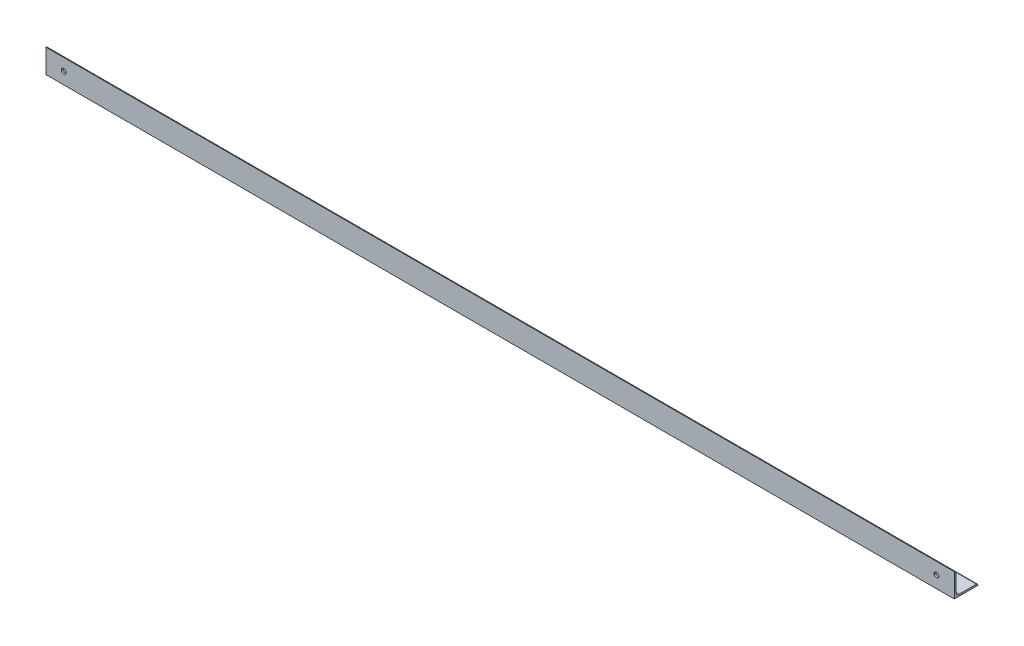
ISO-10303-21;
HEADER;
FILE_DESCRIPTION(('STEP AP214'),'2;1');
FILE_NAME('part.step','',(''),(''),'','','');
FILE_SCHEMA(('AUTOMOTIVE_DESIGN { 1 0 10303 214 1 1 1 1 }'));
ENDSEC;
DATA;
#1=APPLICATION_CONTEXT('core data for automotive mechanical design processes');
#2=APPLICATION_PROTOCOL_DEFINITION('international standard','automotive_design',2000,#1);
#3=PRODUCT_CONTEXT('',#1,'mechanical');
#4=PRODUCT('Part','Part','',(#3));
#5=PRODUCT_RELATED_PRODUCT_CATEGORY('part','',(#4));
#6=PRODUCT_DEFINITION_FORMATION('','',#4);
#7=PRODUCT_DEFINITION_CONTEXT('part definition',#1,'design');
#8=PRODUCT_DEFINITION('design','',#6,#7);
#9=PRODUCT_DEFINITION_SHAPE('','',#8);
#10=(LENGTH_UNIT() NAMED_UNIT(*) SI_UNIT(.MILLI.,.METRE.));
#11=(NAMED_UNIT(*) PLANE_ANGLE_UNIT() SI_UNIT($,.RADIAN.));
#12=(NAMED_UNIT(*) SI_UNIT($,.STERADIAN.) SOLID_ANGLE_UNIT());
#13=UNCERTAINTY_MEASURE_WITH_UNIT(LENGTH_MEASURE(1.E-05),#10,'distance_accuracy_value','');
#14=(GEOMETRIC_REPRESENTATION_CONTEXT(3) GLOBAL_UNCERTAINTY_ASSIGNED_CONTEXT((#13)) GLOBAL_UNIT_ASSIGNED_CONTEXT((#10,
#11,#12)) REPRESENTATION_CONTEXT('',''));
#15=CARTESIAN_POINT('',(0.,0.,0.));
#16=DIRECTION('',(0.,0.,1.));
#17=DIRECTION('',(1.,0.,0.));
#18=AXIS2_PLACEMENT_3D('',#15,#16,#17);
#19=CARTESIAN_POINT('',(1530.,0.,-40.));
#20=DIRECTION('',(0.,1.,0.));
#21=DIRECTION('',(0.,0.,1.));
#22=AXIS2_PLACEMENT_3D('',#19,#20,#21);
#23=PLANE('',#22);
#24=DIRECTION('',(0.,0.,-1.));
#25=VECTOR('',#24,1.);
#26=CARTESIAN_POINT('',(0.,0.,-40.));
#27=LINE('',#26,#25);
#28=CARTESIAN_POINT('',(0.,0.,0.));
#29=VERTEX_POINT('',#28);
#30=CARTESIAN_POINT('',(0.,0.,-40.));
#31=VERTEX_POINT('',#30);
#32=EDGE_CURVE('E153',#29,#31,#27,.T.);
#33=ORIENTED_EDGE('',*,*,#32,.T.);
#34=DIRECTION('',(-1.,0.,0.));
#35=VECTOR('',#34,1.);
#36=CARTESIAN_POINT('',(1530.,0.,-40.));
#37=LINE('',#36,#35);
#38=CARTESIAN_POINT('',(1530.,0.,-40.));
#39=VERTEX_POINT('',#38);
#40=EDGE_CURVE('E13',#39,#31,#37,.T.);
#41=ORIENTED_EDGE('',*,*,#40,.F.);
#42=DIRECTION('',(0.,0.,-1.));
#43=VECTOR('',#42,1.);
#44=CARTESIAN_POINT('',(1530.,0.,-40.));
#45=LINE('',#44,#43);
#46=CARTESIAN_POINT('',(1530.,0.,0.));
#47=VERTEX_POINT('',#46);
#48=EDGE_CURVE('E166',#47,#39,#45,.T.);
#49=ORIENTED_EDGE('',*,*,#48,.F.);
#50=DIRECTION('',(-1.,0.,0.));
#51=VECTOR('',#50,1.);
#52=CARTESIAN_POINT('',(1530.,0.,0.));
#53=LINE('',#52,#51);
#54=EDGE_CURVE('E149',#47,#29,#53,.T.);
#55=ORIENTED_EDGE('',*,*,#54,.T.);
#56=EDGE_LOOP('',(#33,#41,#49,#55));
#57=FACE_BOUND('',#56,.T.);
#58=ADVANCED_FACE('F63',(#57),#23,.F.);
#59=CARTESIAN_POINT('',(1530.,0.,-37.));
#60=DIRECTION('',(-1.,0.,0.));
#61=DIRECTION('',(0.,0.,1.));
#62=AXIS2_PLACEMENT_3D('',#59,#60,#61);
#63=CYLINDRICAL_SURFACE('',#62,3.);
#64=CARTESIAN_POINT('',(0.,0.,-37.));
#65=DIRECTION('',(1.,0.,0.));
#66=DIRECTION('',(0.,0.,-1.));
#67=AXIS2_PLACEMENT_3D('',#64,#65,#66);
#68=CIRCLE('',#67,3.);
#69=CARTESIAN_POINT('',(0.,3.,-37.));
#70=VERTEX_POINT('',#69);
#71=EDGE_CURVE('E156',#31,#70,#68,.T.);
#72=ORIENTED_EDGE('',*,*,#71,.T.);
#73=DIRECTION('',(-1.,0.,0.));
#74=VECTOR('',#73,1.);
#75=CARTESIAN_POINT('',(1530.,3.,-37.));
#76=LINE('',#75,#74);
#77=CARTESIAN_POINT('',(1530.,3.,-37.));
#78=VERTEX_POINT('',#77);
#79=EDGE_CURVE('E71',#78,#70,#76,.T.);
#80=ORIENTED_EDGE('',*,*,#79,.F.);
#81=CARTESIAN_POINT('',(1530.,0.,-37.));
#82=DIRECTION('',(1.,0.,0.));
#83=DIRECTION('',(0.,0.,-1.));
#84=AXIS2_PLACEMENT_3D('',#81,#82,#83);
#85=CIRCLE('',#84,3.);
#86=EDGE_CURVE('E119',#39,#78,#85,.T.);
#87=ORIENTED_EDGE('',*,*,#86,.F.);
#88=ORIENTED_EDGE('',*,*,#40,.T.);
#89=EDGE_LOOP('',(#72,#80,#87,#88));
#90=FACE_BOUND('',#89,.T.);
#91=ADVANCED_FACE('F226',(#90),#63,.T.);
#92=CARTESIAN_POINT('',(1530.,3.,-9.));
#93=DIRECTION('',(0.,-1.,0.));
#94=DIRECTION('',(0.,0.,-1.));
#95=AXIS2_PLACEMENT_3D('',#92,#93,#94);
#96=PLANE('',#95);
#97=DIRECTION('',(0.,0.,1.));
#98=VECTOR('',#97,1.);
#99=CARTESIAN_POINT('',(0.,3.,-9.));
#100=LINE('',#99,#98);
#101=CARTESIAN_POINT('',(0.,3.,-9.00000000000001));
#102=VERTEX_POINT('',#101);
#103=EDGE_CURVE('E159',#70,#102,#100,.T.);
#104=ORIENTED_EDGE('',*,*,#103,.T.);
#105=DIRECTION('',(-1.,0.,0.));
#106=VECTOR('',#105,1.);
#107=CARTESIAN_POINT('',(1530.,3.,-9.00000000000001));
#108=LINE('',#107,#106);
#109=CARTESIAN_POINT('',(1530.,3.,-9.00000000000001));
#110=VERTEX_POINT('',#109);
#111=EDGE_CURVE('E170',#110,#102,#108,.T.);
#112=ORIENTED_EDGE('',*,*,#111,.F.);
#113=DIRECTION('',(0.,0.,1.));
#114=VECTOR('',#113,1.);
#115=CARTESIAN_POINT('',(1530.,3.,-9.));
#116=LINE('',#115,#114);
#117=EDGE_CURVE('E178',#78,#110,#116,.T.);
#118=ORIENTED_EDGE('',*,*,#117,.F.);
#119=ORIENTED_EDGE('',*,*,#79,.T.);
#120=EDGE_LOOP('',(#104,#112,#118,#119));
#121=FACE_BOUND('',#120,.T.);
#122=ADVANCED_FACE('F176',(#121),#96,.F.);
#123=CARTESIAN_POINT('',(1530.,9.,-9.));
#124=DIRECTION('',(-1.,0.,0.));
#125=DIRECTION('',(0.,0.,1.));
#126=AXIS2_PLACEMENT_3D('',#123,#124,#125);
#127=CYLINDRICAL_SURFACE('',#126,6.);
#128=CARTESIAN_POINT('',(0.,9.,-9.));
#129=DIRECTION('',(-1.,0.,0.));
#130=DIRECTION('',(0.,0.,1.));
#131=AXIS2_PLACEMENT_3D('',#128,#129,#130);
#132=CIRCLE('',#131,6.);
#133=CARTESIAN_POINT('',(0.,9.,-3.));
#134=VERTEX_POINT('',#133);
#135=EDGE_CURVE('E161',#102,#134,#132,.T.);
#136=ORIENTED_EDGE('',*,*,#135,.T.);
#137=DIRECTION('',(-1.,0.,0.));
#138=VECTOR('',#137,1.);
#139=CARTESIAN_POINT('',(1530.,9.,-3.));
#140=LINE('',#139,#138);
#141=CARTESIAN_POINT('',(1530.,9.,-3.));
#142=VERTEX_POINT('',#141);
#143=EDGE_CURVE('E144',#142,#134,#140,.T.);
#144=ORIENTED_EDGE('',*,*,#143,.F.);
#145=CARTESIAN_POINT('',(1530.,9.,-9.));
#146=DIRECTION('',(-1.,0.,0.));
#147=DIRECTION('',(0.,0.,1.));
#148=AXIS2_PLACEMENT_3D('',#145,#146,#147);
#149=CIRCLE('',#148,6.);
#150=EDGE_CURVE('E135',#110,#142,#149,.T.);
#151=ORIENTED_EDGE('',*,*,#150,.F.);
#152=ORIENTED_EDGE('',*,*,#111,.T.);
#153=EDGE_LOOP('',(#136,#144,#151,#152));
#154=FACE_BOUND('',#153,.T.);
#155=ADVANCED_FACE('F184',(#154),#127,.F.);
#156=CARTESIAN_POINT('',(1530.,37.,-3.));
#157=DIRECTION('',(0.,0.,1.));
#158=DIRECTION('',(1.,0.,0.));
#159=AXIS2_PLACEMENT_3D('',#156,#157,#158);
#160=PLANE('',#159);
#161=CARTESIAN_POINT('',(1500.,20.,-3.));
#162=DIRECTION('',(0.,0.,1.));
#163=DIRECTION('',(1.,0.,0.));
#164=AXIS2_PLACEMENT_3D('',#161,#162,#163);
#165=CIRCLE('',#164,3.99999999999999);
#166=CARTESIAN_POINT('',(1504.,20.,-3.));
#167=VERTEX_POINT('',#166);
#168=EDGE_CURVE('E157',#167,#167,#165,.T.);
#169=ORIENTED_EDGE('',*,*,#168,.T.);
#170=EDGE_LOOP('',(#169));
#171=FACE_BOUND('',#170,.T.);
#172=CARTESIAN_POINT('',(30.,20.,-3.));
#173=DIRECTION('',(0.,0.,1.));
#174=DIRECTION('',(1.,0.,0.));
#175=AXIS2_PLACEMENT_3D('',#172,#173,#174);
#176=CIRCLE('',#175,4.00000000000001);
#177=CARTESIAN_POINT('',(34.,20.,-3.));
#178=VERTEX_POINT('',#177);
#179=EDGE_CURVE('E191',#178,#178,#176,.T.);
#180=ORIENTED_EDGE('',*,*,#179,.T.);
#181=EDGE_LOOP('',(#180));
#182=FACE_BOUND('',#181,.T.);
#183=DIRECTION('',(0.,1.,0.));
#184=VECTOR('',#183,1.);
#185=CARTESIAN_POINT('',(0.,37.,-3.));
#186=LINE('',#185,#184);
#187=CARTESIAN_POINT('',(0.,37.,-3.));
#188=VERTEX_POINT('',#187);
#189=EDGE_CURVE('E143',#134,#188,#186,.T.);
#190=ORIENTED_EDGE('',*,*,#189,.T.);
#191=DIRECTION('',(-1.,0.,0.));
#192=VECTOR('',#191,1.);
#193=CARTESIAN_POINT('',(1530.,37.,-3.));
#194=LINE('',#193,#192);
#195=CARTESIAN_POINT('',(1530.,37.,-3.));
#196=VERTEX_POINT('',#195);
#197=EDGE_CURVE('E140',#196,#188,#194,.T.);
#198=ORIENTED_EDGE('',*,*,#197,.F.);
#199=DIRECTION('',(0.,1.,0.));
#200=VECTOR('',#199,1.);
#201=CARTESIAN_POINT('',(1530.,37.,-3.));
#202=LINE('',#201,#200);
#203=EDGE_CURVE('E129',#142,#196,#202,.T.);
#204=ORIENTED_EDGE('',*,*,#203,.F.);
#205=ORIENTED_EDGE('',*,*,#143,.T.);
#206=EDGE_LOOP('',(#190,#198,#204,#205));
#207=FACE_BOUND('',#206,.T.);
#208=ADVANCED_FACE('F141',(#171,#182,#207),#160,.F.);
#209=CARTESIAN_POINT('',(1530.,37.,0.));
#210=DIRECTION('',(-1.,0.,0.));
#211=DIRECTION('',(0.,0.,1.));
#212=AXIS2_PLACEMENT_3D('',#209,#210,#211);
#213=CYLINDRICAL_SURFACE('',#212,3.);
#214=CARTESIAN_POINT('',(0.,37.,0.));
#215=DIRECTION('',(1.,0.,0.));
#216=DIRECTION('',(0.,0.,-1.));
#217=AXIS2_PLACEMENT_3D('',#214,#215,#216);
#218=CIRCLE('',#217,3.);
#219=CARTESIAN_POINT('',(0.,40.,0.));
#220=VERTEX_POINT('',#219);
#221=EDGE_CURVE('E105',#188,#220,#218,.T.);
#222=ORIENTED_EDGE('',*,*,#221,.T.);
#223=DIRECTION('',(-1.,0.,0.));
#224=VECTOR('',#223,1.);
#225=CARTESIAN_POINT('',(1530.,40.,0.));
#226=LINE('',#225,#224);
#227=CARTESIAN_POINT('',(1530.,40.,0.));
#228=VERTEX_POINT('',#227);
#229=EDGE_CURVE('E145',#228,#220,#226,.T.);
#230=ORIENTED_EDGE('',*,*,#229,.F.);
#231=CARTESIAN_POINT('',(1530.,37.,0.));
#232=DIRECTION('',(1.,0.,0.));
#233=DIRECTION('',(0.,0.,-1.));
#234=AXIS2_PLACEMENT_3D('',#231,#232,#233);
#235=CIRCLE('',#234,3.);
#236=EDGE_CURVE('E133',#196,#228,#235,.T.);
#237=ORIENTED_EDGE('',*,*,#236,.F.);
#238=ORIENTED_EDGE('',*,*,#197,.T.);
#239=EDGE_LOOP('',(#222,#230,#237,#238));
#240=FACE_BOUND('',#239,.T.);
#241=ADVANCED_FACE('F147',(#240),#213,.T.);
#242=CARTESIAN_POINT('',(1530.,40.,0.));
#243=DIRECTION('',(0.,0.,-1.));
#244=DIRECTION('',(-1.,0.,0.));
#245=AXIS2_PLACEMENT_3D('',#242,#243,#244);
#246=PLANE('',#245);
#247=CARTESIAN_POINT('',(1500.,20.,0.));
#248=DIRECTION('',(0.,0.,1.));
#249=DIRECTION('',(1.,0.,0.));
#250=AXIS2_PLACEMENT_3D('',#247,#248,#249);
#251=CIRCLE('',#250,3.99999999999999);
#252=CARTESIAN_POINT('',(1504.,20.,0.));
#253=VERTEX_POINT('',#252);
#254=EDGE_CURVE('E194',#253,#253,#251,.T.);
#255=ORIENTED_EDGE('',*,*,#254,.F.);
#256=EDGE_LOOP('',(#255));
#257=FACE_BOUND('',#256,.T.);
#258=CARTESIAN_POINT('',(30.,20.,0.));
#259=DIRECTION('',(0.,0.,1.));
#260=DIRECTION('',(1.,0.,0.));
#261=AXIS2_PLACEMENT_3D('',#258,#259,#260);
#262=CIRCLE('',#261,4.00000000000001);
#263=CARTESIAN_POINT('',(34.,20.,0.));
#264=VERTEX_POINT('',#263);
#265=EDGE_CURVE('E195',#264,#264,#262,.T.);
#266=ORIENTED_EDGE('',*,*,#265,.F.);
#267=EDGE_LOOP('',(#266));
#268=FACE_BOUND('',#267,.T.);
#269=DIRECTION('',(0.,-1.,0.));
#270=VECTOR('',#269,1.);
#271=CARTESIAN_POINT('',(0.,40.,0.));
#272=LINE('',#271,#270);
#273=EDGE_CURVE('E111',#220,#29,#272,.T.);
#274=ORIENTED_EDGE('',*,*,#273,.T.);
#275=ORIENTED_EDGE('',*,*,#54,.F.);
#276=DIRECTION('',(0.,-1.,0.));
#277=VECTOR('',#276,1.);
#278=CARTESIAN_POINT('',(1530.,40.,0.));
#279=LINE('',#278,#277);
#280=EDGE_CURVE('E79',#228,#47,#279,.T.);
#281=ORIENTED_EDGE('',*,*,#280,.F.);
#282=ORIENTED_EDGE('',*,*,#229,.T.);
#283=EDGE_LOOP('',(#274,#275,#281,#282));
#284=FACE_BOUND('',#283,.T.);
#285=ADVANCED_FACE('F204',(#257,#268,#284),#246,.F.);
#286=CARTESIAN_POINT('',(1530.,37.,0.));
#287=DIRECTION('',(1.,0.,0.));
#288=DIRECTION('',(0.,0.,-1.));
#289=AXIS2_PLACEMENT_3D('',#286,#287,#288);
#290=PLANE('',#289);
#291=ORIENTED_EDGE('',*,*,#48,.T.);
#292=ORIENTED_EDGE('',*,*,#86,.T.);
#293=ORIENTED_EDGE('',*,*,#117,.T.);
#294=ORIENTED_EDGE('',*,*,#150,.T.);
#295=ORIENTED_EDGE('',*,*,#203,.T.);
#296=ORIENTED_EDGE('',*,*,#236,.T.);
#297=ORIENTED_EDGE('',*,*,#280,.T.);
#298=EDGE_LOOP('',(#291,#292,#293,#294,#295,#296,#297));
#299=FACE_BOUND('',#298,.T.);
#300=ADVANCED_FACE('F131',(#299),#290,.T.);
#301=CARTESIAN_POINT('',(0.,37.,0.));
#302=DIRECTION('',(1.,0.,0.));
#303=DIRECTION('',(0.,0.,-1.));
#304=AXIS2_PLACEMENT_3D('',#301,#302,#303);
#305=PLANE('',#304);
#306=ORIENTED_EDGE('',*,*,#32,.F.);
#307=ORIENTED_EDGE('',*,*,#273,.F.);
#308=ORIENTED_EDGE('',*,*,#221,.F.);
#309=ORIENTED_EDGE('',*,*,#189,.F.);
#310=ORIENTED_EDGE('',*,*,#135,.F.);
#311=ORIENTED_EDGE('',*,*,#103,.F.);
#312=ORIENTED_EDGE('',*,*,#71,.F.);
#313=EDGE_LOOP('',(#306,#307,#308,#309,#310,#311,#312));
#314=FACE_BOUND('',#313,.T.);
#315=ADVANCED_FACE('F182',(#314),#305,.F.);
#316=CARTESIAN_POINT('',(30.,20.,-40.));
#317=DIRECTION('',(0.,0.,1.));
#318=DIRECTION('',(1.,0.,0.));
#319=AXIS2_PLACEMENT_3D('',#316,#317,#318);
#320=CYLINDRICAL_SURFACE('',#319,4.00000000000001);
#321=ORIENTED_EDGE('',*,*,#265,.T.);
#322=EDGE_LOOP('',(#321));
#323=FACE_BOUND('',#322,.T.);
#324=ORIENTED_EDGE('',*,*,#179,.F.);
#325=EDGE_LOOP('',(#324));
#326=FACE_BOUND('',#325,.T.);
#327=ADVANCED_FACE('F210',(#323,#326),#320,.F.);
#328=CARTESIAN_POINT('',(1500.,20.,-40.));
#329=DIRECTION('',(0.,0.,1.));
#330=DIRECTION('',(1.,0.,0.));
#331=AXIS2_PLACEMENT_3D('',#328,#329,#330);
#332=CYLINDRICAL_SURFACE('',#331,3.99999999999999);
#333=ORIENTED_EDGE('',*,*,#254,.T.);
#334=EDGE_LOOP('',(#333));
#335=FACE_BOUND('',#334,.T.);
#336=ORIENTED_EDGE('',*,*,#168,.F.);
#337=EDGE_LOOP('',(#336));
#338=FACE_BOUND('',#337,.T.);
#339=ADVANCED_FACE('F201',(#335,#338),#332,.F.);
#340=CLOSED_SHELL('',(#58,#91,#122,#155,#208,#241,#285,#300,#315,#327,#339));
#341=MANIFOLD_SOLID_BREP('B2',#340);
#342=ADVANCED_BREP_SHAPE_REPRESENTATION('',(#18,#341),#14);
#343=SHAPE_DEFINITION_REPRESENTATION(#9,#342);
ENDSEC;
END-ISO-10303-21;
